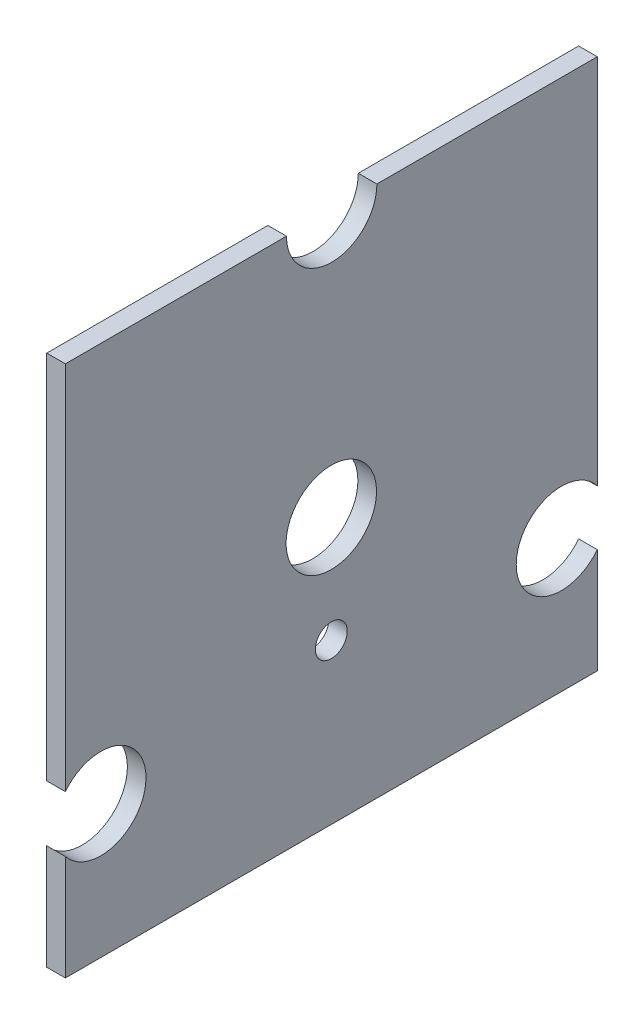
ISO-10303-21;
HEADER;
FILE_DESCRIPTION(('STEP AP214'),'2;1');
FILE_NAME('part.step','',(''),(''),'','','');
FILE_SCHEMA(('AUTOMOTIVE_DESIGN { 1 0 10303 214 1 1 1 1 }'));
ENDSEC;
DATA;
#1=APPLICATION_CONTEXT('core data for automotive mechanical design processes');
#2=APPLICATION_PROTOCOL_DEFINITION('international standard','automotive_design',2000,#1);
#3=PRODUCT_CONTEXT('',#1,'mechanical');
#4=PRODUCT('Part','Part','',(#3));
#5=PRODUCT_RELATED_PRODUCT_CATEGORY('part','',(#4));
#6=PRODUCT_DEFINITION_FORMATION('','',#4);
#7=PRODUCT_DEFINITION_CONTEXT('part definition',#1,'design');
#8=PRODUCT_DEFINITION('design','',#6,#7);
#9=PRODUCT_DEFINITION_SHAPE('','',#8);
#10=(LENGTH_UNIT() NAMED_UNIT(*) SI_UNIT(.MILLI.,.METRE.));
#11=(NAMED_UNIT(*) PLANE_ANGLE_UNIT() SI_UNIT($,.RADIAN.));
#12=(NAMED_UNIT(*) SI_UNIT($,.STERADIAN.) SOLID_ANGLE_UNIT());
#13=UNCERTAINTY_MEASURE_WITH_UNIT(LENGTH_MEASURE(1.E-05),#10,'distance_accuracy_value','');
#14=(GEOMETRIC_REPRESENTATION_CONTEXT(3) GLOBAL_UNCERTAINTY_ASSIGNED_CONTEXT((#13)) GLOBAL_UNIT_ASSIGNED_CONTEXT((#10,
#11,#12)) REPRESENTATION_CONTEXT('',''));
#15=CARTESIAN_POINT('',(0.,0.,0.));
#16=DIRECTION('',(0.,0.,1.));
#17=DIRECTION('',(1.,0.,0.));
#18=AXIS2_PLACEMENT_3D('',#15,#16,#17);
#19=CARTESIAN_POINT('',(3.5,50.,-50.));
#20=DIRECTION('',(0.,0.,1.));
#21=DIRECTION('',(1.,0.,0.));
#22=AXIS2_PLACEMENT_3D('',#19,#20,#21);
#23=PLANE('',#22);
#24=DIRECTION('',(0.,1.,0.));
#25=VECTOR('',#24,1.);
#26=CARTESIAN_POINT('',(3.5,50.,-50.));
#27=LINE('',#26,#25);
#28=CARTESIAN_POINT('',(3.5,-19.8757451505716,-50.));
#29=VERTEX_POINT('',#28);
#30=CARTESIAN_POINT('',(3.5,50.,-50.));
#31=VERTEX_POINT('',#30);
#32=EDGE_CURVE('E180',#29,#31,#27,.T.);
#33=ORIENTED_EDGE('',*,*,#32,.F.);
#34=DIRECTION('',(-1.,0.,0.));
#35=VECTOR('',#34,1.);
#36=CARTESIAN_POINT('',(3.5,-19.8757451505716,-50.));
#37=LINE('',#36,#35);
#38=CARTESIAN_POINT('',(0.,-19.8757451505716,-50.));
#39=VERTEX_POINT('',#38);
#40=EDGE_CURVE('E11',#29,#39,#37,.T.);
#41=ORIENTED_EDGE('',*,*,#40,.T.);
#42=DIRECTION('',(0.,1.,0.));
#43=VECTOR('',#42,1.);
#44=CARTESIAN_POINT('',(0.,50.,-50.));
#45=LINE('',#44,#43);
#46=CARTESIAN_POINT('',(0.,50.,-50.));
#47=VERTEX_POINT('',#46);
#48=EDGE_CURVE('E144',#39,#47,#45,.T.);
#49=ORIENTED_EDGE('',*,*,#48,.T.);
#50=DIRECTION('',(-1.,0.,0.));
#51=VECTOR('',#50,1.);
#52=CARTESIAN_POINT('',(3.5,50.,-50.));
#53=LINE('',#52,#51);
#54=EDGE_CURVE('E150',#31,#47,#53,.T.);
#55=ORIENTED_EDGE('',*,*,#54,.F.);
#56=EDGE_LOOP('',(#33,#41,#49,#55));
#57=FACE_BOUND('',#56,.T.);
#58=ADVANCED_FACE('F38',(#57),#23,.F.);
#59=CARTESIAN_POINT('',(3.5,50.,50.));
#60=DIRECTION('',(0.,-1.,0.));
#61=DIRECTION('',(0.,0.,-1.));
#62=AXIS2_PLACEMENT_3D('',#59,#60,#61);
#63=PLANE('',#62);
#64=DIRECTION('',(0.,0.,1.));
#65=VECTOR('',#64,1.);
#66=CARTESIAN_POINT('',(3.5,50.,50.));
#67=LINE('',#66,#65);
#68=CARTESIAN_POINT('',(3.5,50.,8.42849793626994));
#69=VERTEX_POINT('',#68);
#70=CARTESIAN_POINT('',(3.5,50.,50.));
#71=VERTEX_POINT('',#70);
#72=EDGE_CURVE('E130',#69,#71,#67,.T.);
#73=ORIENTED_EDGE('',*,*,#72,.F.);
#74=DIRECTION('',(-1.,0.,0.));
#75=VECTOR('',#74,1.);
#76=CARTESIAN_POINT('',(3.5,50.,8.42849793626994));
#77=LINE('',#76,#75);
#78=CARTESIAN_POINT('',(0.,50.,8.42849793626994));
#79=VERTEX_POINT('',#78);
#80=EDGE_CURVE('E116',#69,#79,#77,.T.);
#81=ORIENTED_EDGE('',*,*,#80,.T.);
#82=DIRECTION('',(0.,0.,1.));
#83=VECTOR('',#82,1.);
#84=CARTESIAN_POINT('',(0.,50.,50.));
#85=LINE('',#84,#83);
#86=CARTESIAN_POINT('',(0.,50.,50.));
#87=VERTEX_POINT('',#86);
#88=EDGE_CURVE('E128',#79,#87,#85,.T.);
#89=ORIENTED_EDGE('',*,*,#88,.T.);
#90=DIRECTION('',(-1.,0.,0.));
#91=VECTOR('',#90,1.);
#92=CARTESIAN_POINT('',(3.5,50.,50.));
#93=LINE('',#92,#91);
#94=EDGE_CURVE('E148',#71,#87,#93,.T.);
#95=ORIENTED_EDGE('',*,*,#94,.F.);
#96=EDGE_LOOP('',(#73,#81,#89,#95));
#97=FACE_BOUND('',#96,.T.);
#98=ADVANCED_FACE('F126',(#97),#63,.F.);
#99=CARTESIAN_POINT('',(3.5,50.,50.));
#100=DIRECTION('',(0.,0.,-1.));
#101=DIRECTION('',(-1.,0.,0.));
#102=AXIS2_PLACEMENT_3D('',#99,#100,#101);
#103=PLANE('',#102);
#104=DIRECTION('',(0.,-1.,0.));
#105=VECTOR('',#104,1.);
#106=CARTESIAN_POINT('',(3.5,50.,50.));
#107=LINE('',#106,#105);
#108=CARTESIAN_POINT('',(3.5,-30.2157524476074,50.));
#109=VERTEX_POINT('',#108);
#110=CARTESIAN_POINT('',(3.5,-50.,50.));
#111=VERTEX_POINT('',#110);
#112=EDGE_CURVE('E142',#109,#111,#107,.T.);
#113=ORIENTED_EDGE('',*,*,#112,.F.);
#114=DIRECTION('',(-1.,0.,0.));
#115=VECTOR('',#114,1.);
#116=CARTESIAN_POINT('',(3.5,-30.2157524476074,50.));
#117=LINE('',#116,#115);
#118=CARTESIAN_POINT('',(0.,-30.2157524476074,50.));
#119=VERTEX_POINT('',#118);
#120=EDGE_CURVE('E163',#109,#119,#117,.T.);
#121=ORIENTED_EDGE('',*,*,#120,.T.);
#122=DIRECTION('',(0.,-1.,0.));
#123=VECTOR('',#122,1.);
#124=CARTESIAN_POINT('',(0.,50.,50.));
#125=LINE('',#124,#123);
#126=CARTESIAN_POINT('',(0.,-50.,50.));
#127=VERTEX_POINT('',#126);
#128=EDGE_CURVE('E188',#119,#127,#125,.T.);
#129=ORIENTED_EDGE('',*,*,#128,.T.);
#130=DIRECTION('',(-1.,0.,0.));
#131=VECTOR('',#130,1.);
#132=CARTESIAN_POINT('',(3.5,-50.,50.));
#133=LINE('',#132,#131);
#134=EDGE_CURVE('E157',#111,#127,#133,.T.);
#135=ORIENTED_EDGE('',*,*,#134,.F.);
#136=EDGE_LOOP('',(#113,#121,#129,#135));
#137=FACE_BOUND('',#136,.T.);
#138=ADVANCED_FACE('F218',(#137),#103,.F.);
#139=CARTESIAN_POINT('',(3.5,0.,0.));
#140=DIRECTION('',(1.,0.,0.));
#141=DIRECTION('',(0.,0.,-1.));
#142=AXIS2_PLACEMENT_3D('',#139,#140,#141);
#143=PLANE('',#142);
#144=CARTESIAN_POINT('',(3.5,-20.,0.));
#145=DIRECTION('',(-1.,0.,0.));
#146=DIRECTION('',(0.,0.,1.));
#147=AXIS2_PLACEMENT_3D('',#144,#145,#146);
#148=CIRCLE('',#147,3.);
#149=CARTESIAN_POINT('',(3.5,-20.,3.));
#150=VERTEX_POINT('',#149);
#151=EDGE_CURVE('E122',#150,#150,#148,.T.);
#152=ORIENTED_EDGE('',*,*,#151,.T.);
#153=EDGE_LOOP('',(#152));
#154=FACE_BOUND('',#153,.T.);
#155=CARTESIAN_POINT('',(3.5,-25.0618970407415,-43.2654748814718));
#156=DIRECTION('',(-1.,0.,0.));
#157=DIRECTION('',(0.,0.,1.));
#158=AXIS2_PLACEMENT_3D('',#155,#156,#157);
#159=CIRCLE('',#158,8.5);
#160=CARTESIAN_POINT('',(3.5,-30.2480489309114,-50.));
#161=VERTEX_POINT('',#160);
#162=EDGE_CURVE('E53',#161,#29,#159,.T.);
#163=ORIENTED_EDGE('',*,*,#162,.T.);
#164=ORIENTED_EDGE('',*,*,#32,.T.);
#165=CARTESIAN_POINT('',(3.5,50.,-8.57150206357631));
#166=VERTEX_POINT('',#165);
#167=EDGE_CURVE('E151',#31,#166,#67,.T.);
#168=ORIENTED_EDGE('',*,*,#167,.T.);
#169=CARTESIAN_POINT('',(3.5,49.9999488745229,-0.0715020635763067));
#170=DIRECTION('',(-1.,0.,0.));
#171=DIRECTION('',(0.,0.,1.));
#172=AXIS2_PLACEMENT_3D('',#169,#170,#171);
#173=CIRCLE('',#172,8.5);
#174=EDGE_CURVE('E61',#166,#69,#173,.T.);
#175=ORIENTED_EDGE('',*,*,#174,.T.);
#176=ORIENTED_EDGE('',*,*,#72,.T.);
#177=CARTESIAN_POINT('',(3.5,-19.6603512199553,50.));
#178=VERTEX_POINT('',#177);
#179=EDGE_CURVE('E212',#71,#178,#107,.T.);
#180=ORIENTED_EDGE('',*,*,#179,.T.);
#181=CARTESIAN_POINT('',(3.5,-24.9380518337814,43.3369769450481));
#182=DIRECTION('',(-1.,0.,0.));
#183=DIRECTION('',(0.,0.,1.));
#184=AXIS2_PLACEMENT_3D('',#181,#182,#183);
#185=CIRCLE('',#184,8.5);
#186=EDGE_CURVE('E202',#178,#109,#185,.T.);
#187=ORIENTED_EDGE('',*,*,#186,.T.);
#188=ORIENTED_EDGE('',*,*,#112,.T.);
#189=DIRECTION('',(0.,0.,-1.));
#190=VECTOR('',#189,1.);
#191=CARTESIAN_POINT('',(3.5,-50.,50.));
#192=LINE('',#191,#190);
#193=CARTESIAN_POINT('',(3.5,-50.,-50.));
#194=VERTEX_POINT('',#193);
#195=EDGE_CURVE('E178',#111,#194,#192,.T.);
#196=ORIENTED_EDGE('',*,*,#195,.T.);
#197=EDGE_CURVE('E170',#194,#161,#27,.T.);
#198=ORIENTED_EDGE('',*,*,#197,.T.);
#199=EDGE_LOOP('',(#163,#164,#168,#175,#176,#180,#187,#188,#196,#198));
#200=FACE_BOUND('',#199,.T.);
#201=CARTESIAN_POINT('',(3.5,0.,0.));
#202=DIRECTION('',(1.,0.,0.));
#203=DIRECTION('',(0.,0.,-1.));
#204=AXIS2_PLACEMENT_3D('',#201,#202,#203);
#205=CIRCLE('',#204,8.5);
#206=CARTESIAN_POINT('',(3.5,0.,-8.5));
#207=VERTEX_POINT('',#206);
#208=EDGE_CURVE('E208',#207,#207,#205,.T.);
#209=ORIENTED_EDGE('',*,*,#208,.F.);
#210=EDGE_LOOP('',(#209));
#211=FACE_BOUND('',#210,.T.);
#212=ADVANCED_FACE('F174',(#154,#200,#211),#143,.T.);
#213=CARTESIAN_POINT('',(0.,0.,0.));
#214=DIRECTION('',(1.,0.,0.));
#215=DIRECTION('',(0.,0.,-1.));
#216=AXIS2_PLACEMENT_3D('',#213,#214,#215);
#217=PLANE('',#216);
#218=CARTESIAN_POINT('',(0.,-20.,0.));
#219=DIRECTION('',(-1.,0.,0.));
#220=DIRECTION('',(0.,0.,1.));
#221=AXIS2_PLACEMENT_3D('',#218,#219,#220);
#222=CIRCLE('',#221,3.);
#223=CARTESIAN_POINT('',(0.,-20.,3.));
#224=VERTEX_POINT('',#223);
#225=EDGE_CURVE('E342',#224,#224,#222,.T.);
#226=ORIENTED_EDGE('',*,*,#225,.F.);
#227=EDGE_LOOP('',(#226));
#228=FACE_BOUND('',#227,.T.);
#229=ORIENTED_EDGE('',*,*,#48,.F.);
#230=CARTESIAN_POINT('',(0.,-25.0618970407415,-43.2654748814718));
#231=DIRECTION('',(-1.,0.,0.));
#232=DIRECTION('',(0.,0.,1.));
#233=AXIS2_PLACEMENT_3D('',#230,#231,#232);
#234=CIRCLE('',#233,8.5);
#235=CARTESIAN_POINT('',(0.,-30.2480489309114,-50.));
#236=VERTEX_POINT('',#235);
#237=EDGE_CURVE('E197',#236,#39,#234,.T.);
#238=ORIENTED_EDGE('',*,*,#237,.F.);
#239=CARTESIAN_POINT('',(0.,-50.,-50.));
#240=VERTEX_POINT('',#239);
#241=EDGE_CURVE('E140',#240,#236,#45,.T.);
#242=ORIENTED_EDGE('',*,*,#241,.F.);
#243=DIRECTION('',(0.,0.,-1.));
#244=VECTOR('',#243,1.);
#245=CARTESIAN_POINT('',(0.,-50.,50.));
#246=LINE('',#245,#244);
#247=EDGE_CURVE('E187',#127,#240,#246,.T.);
#248=ORIENTED_EDGE('',*,*,#247,.F.);
#249=ORIENTED_EDGE('',*,*,#128,.F.);
#250=CARTESIAN_POINT('',(0.,-24.9380518337814,43.3369769450481));
#251=DIRECTION('',(-1.,0.,0.));
#252=DIRECTION('',(0.,0.,1.));
#253=AXIS2_PLACEMENT_3D('',#250,#251,#252);
#254=CIRCLE('',#253,8.5);
#255=CARTESIAN_POINT('',(0.,-19.6603512199553,50.));
#256=VERTEX_POINT('',#255);
#257=EDGE_CURVE('E206',#256,#119,#254,.T.);
#258=ORIENTED_EDGE('',*,*,#257,.F.);
#259=EDGE_CURVE('E138',#87,#256,#125,.T.);
#260=ORIENTED_EDGE('',*,*,#259,.F.);
#261=ORIENTED_EDGE('',*,*,#88,.F.);
#262=CARTESIAN_POINT('',(0.,49.9999488745229,-0.0715020635763067));
#263=DIRECTION('',(-1.,0.,0.));
#264=DIRECTION('',(0.,0.,1.));
#265=AXIS2_PLACEMENT_3D('',#262,#263,#264);
#266=CIRCLE('',#265,8.5);
#267=CARTESIAN_POINT('',(0.,50.,-8.57150206342255));
#268=VERTEX_POINT('',#267);
#269=EDGE_CURVE('E113',#268,#79,#266,.T.);
#270=ORIENTED_EDGE('',*,*,#269,.F.);
#271=EDGE_CURVE('E139',#47,#268,#85,.T.);
#272=ORIENTED_EDGE('',*,*,#271,.F.);
#273=EDGE_LOOP('',(#229,#238,#242,#248,#249,#258,#260,#261,#270,#272));
#274=FACE_BOUND('',#273,.T.);
#275=CARTESIAN_POINT('',(0.,0.,0.));
#276=DIRECTION('',(1.,0.,0.));
#277=DIRECTION('',(0.,0.,-1.));
#278=AXIS2_PLACEMENT_3D('',#275,#276,#277);
#279=CIRCLE('',#278,8.5);
#280=CARTESIAN_POINT('',(0.,0.,-8.5));
#281=VERTEX_POINT('',#280);
#282=EDGE_CURVE('E205',#281,#281,#279,.T.);
#283=ORIENTED_EDGE('',*,*,#282,.T.);
#284=EDGE_LOOP('',(#283));
#285=FACE_BOUND('',#284,.T.);
#286=ADVANCED_FACE('F134',(#228,#274,#285),#217,.F.);
#287=ORIENTED_EDGE('',*,*,#259,.T.);
#288=DIRECTION('',(-1.,0.,0.));
#289=VECTOR('',#288,1.);
#290=CARTESIAN_POINT('',(3.5,-19.6603512199553,50.));
#291=LINE('',#290,#289);
#292=EDGE_CURVE('E160',#256,#178,#291,.F.);
#293=ORIENTED_EDGE('',*,*,#292,.T.);
#294=ORIENTED_EDGE('',*,*,#179,.F.);
#295=ORIENTED_EDGE('',*,*,#94,.T.);
#296=EDGE_LOOP('',(#287,#293,#294,#295));
#297=FACE_BOUND('',#296,.T.);
#298=ADVANCED_FACE('F40',(#297),#103,.F.);
#299=CARTESIAN_POINT('',(3.5,-50.,50.));
#300=DIRECTION('',(0.,1.,0.));
#301=DIRECTION('',(0.,0.,1.));
#302=AXIS2_PLACEMENT_3D('',#299,#300,#301);
#303=PLANE('',#302);
#304=ORIENTED_EDGE('',*,*,#247,.T.);
#305=DIRECTION('',(-1.,0.,0.));
#306=VECTOR('',#305,1.);
#307=CARTESIAN_POINT('',(3.5,-50.,-50.));
#308=LINE('',#307,#306);
#309=EDGE_CURVE('E154',#194,#240,#308,.T.);
#310=ORIENTED_EDGE('',*,*,#309,.F.);
#311=ORIENTED_EDGE('',*,*,#195,.F.);
#312=ORIENTED_EDGE('',*,*,#134,.T.);
#313=EDGE_LOOP('',(#304,#310,#311,#312));
#314=FACE_BOUND('',#313,.T.);
#315=ADVANCED_FACE('F217',(#314),#303,.F.);
#316=ORIENTED_EDGE('',*,*,#241,.T.);
#317=DIRECTION('',(-1.,0.,0.));
#318=VECTOR('',#317,1.);
#319=CARTESIAN_POINT('',(3.5,-30.2480489309114,-50.));
#320=LINE('',#319,#318);
#321=EDGE_CURVE('E46',#236,#161,#320,.F.);
#322=ORIENTED_EDGE('',*,*,#321,.T.);
#323=ORIENTED_EDGE('',*,*,#197,.F.);
#324=ORIENTED_EDGE('',*,*,#309,.T.);
#325=EDGE_LOOP('',(#316,#322,#323,#324));
#326=FACE_BOUND('',#325,.T.);
#327=ADVANCED_FACE('F169',(#326),#23,.F.);
#328=ORIENTED_EDGE('',*,*,#271,.T.);
#329=DIRECTION('',(-1.,0.,0.));
#330=VECTOR('',#329,1.);
#331=CARTESIAN_POINT('',(3.5,50.,-8.57150206342255));
#332=LINE('',#331,#330);
#333=EDGE_CURVE('E117',#268,#166,#332,.F.);
#334=ORIENTED_EDGE('',*,*,#333,.T.);
#335=ORIENTED_EDGE('',*,*,#167,.F.);
#336=ORIENTED_EDGE('',*,*,#54,.T.);
#337=EDGE_LOOP('',(#328,#334,#335,#336));
#338=FACE_BOUND('',#337,.T.);
#339=ADVANCED_FACE('F195',(#338),#63,.F.);
#340=CARTESIAN_POINT('',(3.5,0.,0.));
#341=DIRECTION('',(-1.,0.,0.));
#342=DIRECTION('',(0.,0.,1.));
#343=AXIS2_PLACEMENT_3D('',#340,#341,#342);
#344=CYLINDRICAL_SURFACE('',#343,8.5);
#345=ORIENTED_EDGE('',*,*,#208,.T.);
#346=EDGE_LOOP('',(#345));
#347=FACE_BOUND('',#346,.T.);
#348=ORIENTED_EDGE('',*,*,#282,.F.);
#349=EDGE_LOOP('',(#348));
#350=FACE_BOUND('',#349,.T.);
#351=ADVANCED_FACE('F243',(#347,#350),#344,.F.);
#352=CARTESIAN_POINT('',(3.5,-24.9380518337814,43.3369769450481));
#353=DIRECTION('',(-1.,0.,0.));
#354=DIRECTION('',(0.,0.,1.));
#355=AXIS2_PLACEMENT_3D('',#352,#353,#354);
#356=CYLINDRICAL_SURFACE('',#355,8.5);
#357=ORIENTED_EDGE('',*,*,#186,.F.);
#358=ORIENTED_EDGE('',*,*,#292,.F.);
#359=ORIENTED_EDGE('',*,*,#257,.T.);
#360=ORIENTED_EDGE('',*,*,#120,.F.);
#361=EDGE_LOOP('',(#357,#358,#359,#360));
#362=FACE_BOUND('',#361,.T.);
#363=ADVANCED_FACE('F230',(#362),#356,.F.);
#364=CARTESIAN_POINT('',(3.5,49.9999488745229,-0.0715020635763067));
#365=DIRECTION('',(-1.,0.,0.));
#366=DIRECTION('',(0.,0.,1.));
#367=AXIS2_PLACEMENT_3D('',#364,#365,#366);
#368=CYLINDRICAL_SURFACE('',#367,8.5);
#369=ORIENTED_EDGE('',*,*,#174,.F.);
#370=ORIENTED_EDGE('',*,*,#333,.F.);
#371=ORIENTED_EDGE('',*,*,#269,.T.);
#372=ORIENTED_EDGE('',*,*,#80,.F.);
#373=EDGE_LOOP('',(#369,#370,#371,#372));
#374=FACE_BOUND('',#373,.T.);
#375=ADVANCED_FACE('F115',(#374),#368,.F.);
#376=CARTESIAN_POINT('',(3.5,-25.0618970407415,-43.2654748814718));
#377=DIRECTION('',(-1.,0.,0.));
#378=DIRECTION('',(0.,0.,1.));
#379=AXIS2_PLACEMENT_3D('',#376,#377,#378);
#380=CYLINDRICAL_SURFACE('',#379,8.5);
#381=ORIENTED_EDGE('',*,*,#162,.F.);
#382=ORIENTED_EDGE('',*,*,#321,.F.);
#383=ORIENTED_EDGE('',*,*,#237,.T.);
#384=ORIENTED_EDGE('',*,*,#40,.F.);
#385=EDGE_LOOP('',(#381,#382,#383,#384));
#386=FACE_BOUND('',#385,.T.);
#387=ADVANCED_FACE('F220',(#386),#380,.F.);
#388=CARTESIAN_POINT('',(3.5,-20.,0.));
#389=DIRECTION('',(-1.,0.,0.));
#390=DIRECTION('',(0.,0.,1.));
#391=AXIS2_PLACEMENT_3D('',#388,#389,#390);
#392=CYLINDRICAL_SURFACE('',#391,3.);
#393=ORIENTED_EDGE('',*,*,#151,.F.);
#394=EDGE_LOOP('',(#393));
#395=FACE_BOUND('',#394,.T.);
#396=ORIENTED_EDGE('',*,*,#225,.T.);
#397=EDGE_LOOP('',(#396));
#398=FACE_BOUND('',#397,.T.);
#399=ADVANCED_FACE('F222',(#395,#398),#392,.F.);
#400=CLOSED_SHELL('',(#58,#98,#138,#212,#286,#298,#315,#327,#339,#351,#363,#375,#387,#399));
#401=MANIFOLD_SOLID_BREP('B2',#400);
#402=ADVANCED_BREP_SHAPE_REPRESENTATION('',(#18,#401),#14);
#403=SHAPE_DEFINITION_REPRESENTATION(#9,#402);
ENDSEC;
END-ISO-10303-21;
